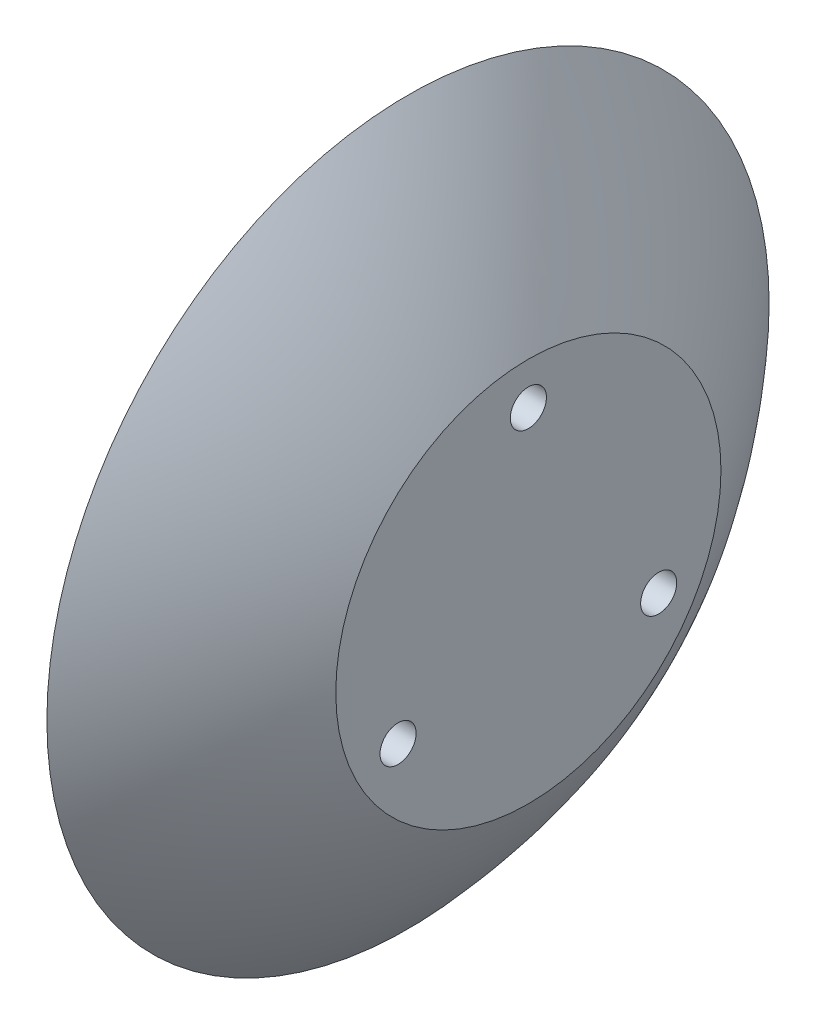
ISO-10303-21;
HEADER;
FILE_DESCRIPTION(('STEP AP214'),'2;1');
FILE_NAME('part.step','',(''),(''),'','','');
FILE_SCHEMA(('AUTOMOTIVE_DESIGN { 1 0 10303 214 1 1 1 1 }'));
ENDSEC;
DATA;
#1=APPLICATION_CONTEXT('core data for automotive mechanical design processes');
#2=APPLICATION_PROTOCOL_DEFINITION('international standard','automotive_design',2000,#1);
#3=PRODUCT_CONTEXT('',#1,'mechanical');
#4=PRODUCT('Part','Part','',(#3));
#5=PRODUCT_RELATED_PRODUCT_CATEGORY('part','',(#4));
#6=PRODUCT_DEFINITION_FORMATION('','',#4);
#7=PRODUCT_DEFINITION_CONTEXT('part definition',#1,'design');
#8=PRODUCT_DEFINITION('design','',#6,#7);
#9=PRODUCT_DEFINITION_SHAPE('','',#8);
#10=(LENGTH_UNIT() NAMED_UNIT(*) SI_UNIT(.MILLI.,.METRE.));
#11=(NAMED_UNIT(*) PLANE_ANGLE_UNIT() SI_UNIT($,.RADIAN.));
#12=(NAMED_UNIT(*) SI_UNIT($,.STERADIAN.) SOLID_ANGLE_UNIT());
#13=UNCERTAINTY_MEASURE_WITH_UNIT(LENGTH_MEASURE(1.E-05),#10,'distance_accuracy_value','');
#14=(GEOMETRIC_REPRESENTATION_CONTEXT(3) GLOBAL_UNCERTAINTY_ASSIGNED_CONTEXT((#13)) GLOBAL_UNIT_ASSIGNED_CONTEXT((#10,
#11,#12)) REPRESENTATION_CONTEXT('',''));
#15=CARTESIAN_POINT('',(0.,0.,0.));
#16=DIRECTION('',(0.,0.,1.));
#17=DIRECTION('',(1.,0.,0.));
#18=AXIS2_PLACEMENT_3D('',#15,#16,#17);
#19=CARTESIAN_POINT('',(10.,0.,0.));
#20=DIRECTION('',(1.,0.,0.));
#21=DIRECTION('',(0.,0.,-1.));
#22=AXIS2_PLACEMENT_3D('',#19,#20,#21);
#23=PLANE('',#22);
#24=CARTESIAN_POINT('',(10.,12.5,0.));
#25=DIRECTION('',(1.,0.,0.));
#26=DIRECTION('',(0.,0.,-1.));
#27=AXIS2_PLACEMENT_3D('',#24,#25,#26);
#28=CIRCLE('',#27,1.5);
#29=CARTESIAN_POINT('',(10.,12.5,-1.5));
#30=VERTEX_POINT('',#29);
#31=EDGE_CURVE('E54',#30,#30,#28,.T.);
#32=ORIENTED_EDGE('',*,*,#31,.F.);
#33=EDGE_LOOP('',(#32));
#34=FACE_BOUND('',#33,.T.);
#35=CARTESIAN_POINT('',(10.,-6.25000000000097,-10.8253175473049));
#36=DIRECTION('',(1.,0.,0.));
#37=DIRECTION('',(0.,0.,-1.));
#38=AXIS2_PLACEMENT_3D('',#35,#36,#37);
#39=CIRCLE('',#38,1.49999999999899);
#40=CARTESIAN_POINT('',(10.,-6.25000000000097,-12.3253175473039));
#41=VERTEX_POINT('',#40);
#42=EDGE_CURVE('E65',#41,#41,#39,.T.);
#43=ORIENTED_EDGE('',*,*,#42,.F.);
#44=EDGE_LOOP('',(#43));
#45=FACE_BOUND('',#44,.T.);
#46=CARTESIAN_POINT('',(10.,-6.24999999999806,10.8253175473066));
#47=DIRECTION('',(1.,0.,0.));
#48=DIRECTION('',(0.,0.,-1.));
#49=AXIS2_PLACEMENT_3D('',#46,#47,#48);
#50=CIRCLE('',#49,1.49999999999797);
#51=CARTESIAN_POINT('',(10.,-6.24999999999806,9.32531754730863));
#52=VERTEX_POINT('',#51);
#53=EDGE_CURVE('E57',#52,#52,#50,.T.);
#54=ORIENTED_EDGE('',*,*,#53,.F.);
#55=EDGE_LOOP('',(#54));
#56=FACE_BOUND('',#55,.T.);
#57=CARTESIAN_POINT('',(9.99999999999999,0.,0.));
#58=DIRECTION('',(1.,0.,0.));
#59=DIRECTION('',(0.,0.,-1.));
#60=AXIS2_PLACEMENT_3D('',#57,#58,#59);
#61=CIRCLE('',#60,16.);
#62=CARTESIAN_POINT('',(9.99999999999999,0.,-16.));
#63=VERTEX_POINT('',#62);
#64=EDGE_CURVE('E10',#63,#63,#61,.T.);
#65=ORIENTED_EDGE('',*,*,#64,.T.);
#66=EDGE_LOOP('',(#65));
#67=FACE_BOUND('',#66,.T.);
#68=ADVANCED_FACE('F37',(#34,#45,#56,#67),#23,.T.);
#69=CARTESIAN_POINT('',(-56.6101035940118,0.,0.));
#70=DIRECTION('',(1.,0.,0.));
#71=DIRECTION('',(0.,0.,-1.));
#72=AXIS2_PLACEMENT_3D('',#69,#70,#71);
#73=DEGENERATE_TOROIDAL_SURFACE('',#72,21.0072168528656,76.2,.F.);
#74=CARTESIAN_POINT('',(0.,0.,0.));
#75=DIRECTION('',(1.,0.,0.));
#76=DIRECTION('',(0.,0.,-1.));
#77=AXIS2_PLACEMENT_3D('',#74,#75,#76);
#78=CIRCLE('',#77,30.);
#79=CARTESIAN_POINT('',(0.,0.,-30.));
#80=VERTEX_POINT('',#79);
#81=EDGE_CURVE('E44',#80,#80,#78,.T.);
#82=ORIENTED_EDGE('',*,*,#81,.T.);
#83=EDGE_LOOP('',(#82));
#84=FACE_BOUND('',#83,.T.);
#85=ORIENTED_EDGE('',*,*,#64,.F.);
#86=EDGE_LOOP('',(#85));
#87=FACE_BOUND('',#86,.T.);
#88=ADVANCED_FACE('F81',(#84,#87),#73,.F.);
#89=CARTESIAN_POINT('',(0.,0.,0.));
#90=DIRECTION('',(-1.,0.,0.));
#91=DIRECTION('',(0.,0.,1.));
#92=AXIS2_PLACEMENT_3D('',#89,#90,#91);
#93=PLANE('',#92);
#94=CARTESIAN_POINT('',(0.,12.5,0.));
#95=DIRECTION('',(1.,0.,0.));
#96=DIRECTION('',(0.,0.,-1.));
#97=AXIS2_PLACEMENT_3D('',#94,#95,#96);
#98=CIRCLE('',#97,1.5);
#99=CARTESIAN_POINT('',(0.,12.5,-1.5));
#100=VERTEX_POINT('',#99);
#101=EDGE_CURVE('E49',#100,#100,#98,.T.);
#102=ORIENTED_EDGE('',*,*,#101,.T.);
#103=EDGE_LOOP('',(#102));
#104=FACE_BOUND('',#103,.T.);
#105=CARTESIAN_POINT('',(0.,-6.25000000000097,-10.8253175473049));
#106=DIRECTION('',(1.,0.,0.));
#107=DIRECTION('',(0.,0.,-1.));
#108=AXIS2_PLACEMENT_3D('',#105,#106,#107);
#109=CIRCLE('',#108,1.49999999999899);
#110=CARTESIAN_POINT('',(0.,-6.25000000000097,-12.3253175473039));
#111=VERTEX_POINT('',#110);
#112=EDGE_CURVE('E69',#111,#111,#109,.T.);
#113=ORIENTED_EDGE('',*,*,#112,.T.);
#114=EDGE_LOOP('',(#113));
#115=FACE_BOUND('',#114,.T.);
#116=CARTESIAN_POINT('',(0.,-6.24999999999806,10.8253175473066));
#117=DIRECTION('',(1.,0.,0.));
#118=DIRECTION('',(0.,0.,-1.));
#119=AXIS2_PLACEMENT_3D('',#116,#117,#118);
#120=CIRCLE('',#119,1.49999999999797);
#121=CARTESIAN_POINT('',(0.,-6.24999999999806,9.32531754730863));
#122=VERTEX_POINT('',#121);
#123=EDGE_CURVE('E61',#122,#122,#120,.T.);
#124=ORIENTED_EDGE('',*,*,#123,.T.);
#125=EDGE_LOOP('',(#124));
#126=FACE_BOUND('',#125,.T.);
#127=ORIENTED_EDGE('',*,*,#81,.F.);
#128=EDGE_LOOP('',(#127));
#129=FACE_BOUND('',#128,.T.);
#130=ADVANCED_FACE('F89',(#104,#115,#126,#129),#93,.T.);
#131=CARTESIAN_POINT('',(0.,-6.24999999999806,10.8253175473066));
#132=DIRECTION('',(1.,0.,0.));
#133=DIRECTION('',(0.,0.,-1.));
#134=AXIS2_PLACEMENT_3D('',#131,#132,#133);
#135=CYLINDRICAL_SURFACE('',#134,1.49999999999797);
#136=ORIENTED_EDGE('',*,*,#123,.F.);
#137=EDGE_LOOP('',(#136));
#138=FACE_BOUND('',#137,.T.);
#139=ORIENTED_EDGE('',*,*,#53,.T.);
#140=EDGE_LOOP('',(#139));
#141=FACE_BOUND('',#140,.T.);
#142=ADVANCED_FACE('F86',(#138,#141),#135,.F.);
#143=CARTESIAN_POINT('',(0.,-6.25000000000097,-10.8253175473049));
#144=DIRECTION('',(1.,0.,0.));
#145=DIRECTION('',(0.,0.,-1.));
#146=AXIS2_PLACEMENT_3D('',#143,#144,#145);
#147=CYLINDRICAL_SURFACE('',#146,1.49999999999899);
#148=ORIENTED_EDGE('',*,*,#112,.F.);
#149=EDGE_LOOP('',(#148));
#150=FACE_BOUND('',#149,.T.);
#151=ORIENTED_EDGE('',*,*,#42,.T.);
#152=EDGE_LOOP('',(#151));
#153=FACE_BOUND('',#152,.T.);
#154=ADVANCED_FACE('F88',(#150,#153),#147,.F.);
#155=CARTESIAN_POINT('',(0.,12.5,0.));
#156=DIRECTION('',(1.,0.,0.));
#157=DIRECTION('',(0.,0.,-1.));
#158=AXIS2_PLACEMENT_3D('',#155,#156,#157);
#159=CYLINDRICAL_SURFACE('',#158,1.5);
#160=ORIENTED_EDGE('',*,*,#101,.F.);
#161=EDGE_LOOP('',(#160));
#162=FACE_BOUND('',#161,.T.);
#163=ORIENTED_EDGE('',*,*,#31,.T.);
#164=EDGE_LOOP('',(#163));
#165=FACE_BOUND('',#164,.T.);
#166=ADVANCED_FACE('F77',(#162,#165),#159,.F.);
#167=CLOSED_SHELL('',(#68,#88,#130,#142,#154,#166));
#168=MANIFOLD_SOLID_BREP('B2',#167);
#169=ADVANCED_BREP_SHAPE_REPRESENTATION('',(#18,#168),#14);
#170=SHAPE_DEFINITION_REPRESENTATION(#9,#169);
ENDSEC;
END-ISO-10303-21;
